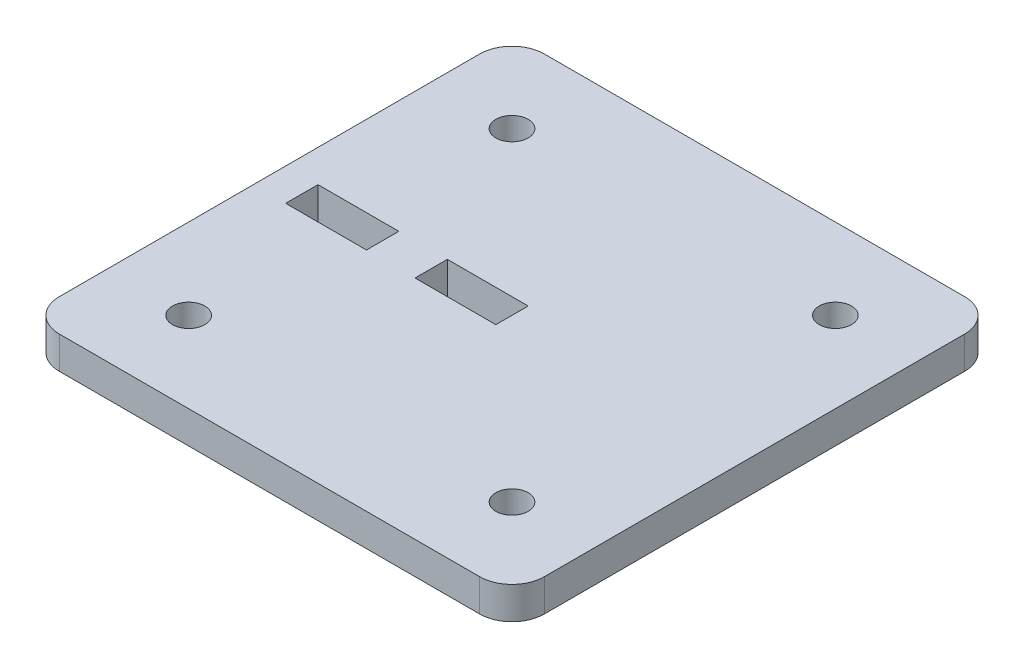
ISO-10303-21;
HEADER;
FILE_DESCRIPTION(('STEP AP214'),'2;1');
FILE_NAME('part.step','',(''),(''),'','','');
FILE_SCHEMA(('AUTOMOTIVE_DESIGN { 1 0 10303 214 1 1 1 1 }'));
ENDSEC;
DATA;
#1=APPLICATION_CONTEXT('core data for automotive mechanical design processes');
#2=APPLICATION_PROTOCOL_DEFINITION('international standard','automotive_design',2000,#1);
#3=PRODUCT_CONTEXT('',#1,'mechanical');
#4=PRODUCT('Part','Part','',(#3));
#5=PRODUCT_RELATED_PRODUCT_CATEGORY('part','',(#4));
#6=PRODUCT_DEFINITION_FORMATION('','',#4);
#7=PRODUCT_DEFINITION_CONTEXT('part definition',#1,'design');
#8=PRODUCT_DEFINITION('design','',#6,#7);
#9=PRODUCT_DEFINITION_SHAPE('','',#8);
#10=(LENGTH_UNIT() NAMED_UNIT(*) SI_UNIT(.MILLI.,.METRE.));
#11=(NAMED_UNIT(*) PLANE_ANGLE_UNIT() SI_UNIT($,.RADIAN.));
#12=(NAMED_UNIT(*) SI_UNIT($,.STERADIAN.) SOLID_ANGLE_UNIT());
#13=UNCERTAINTY_MEASURE_WITH_UNIT(LENGTH_MEASURE(1.E-05),#10,'distance_accuracy_value','');
#14=(GEOMETRIC_REPRESENTATION_CONTEXT(3) GLOBAL_UNCERTAINTY_ASSIGNED_CONTEXT((#13)) GLOBAL_UNIT_ASSIGNED_CONTEXT((#10,
#11,#12)) REPRESENTATION_CONTEXT('',''));
#15=CARTESIAN_POINT('',(0.,0.,0.));
#16=DIRECTION('',(0.,0.,1.));
#17=DIRECTION('',(1.,0.,0.));
#18=AXIS2_PLACEMENT_3D('',#15,#16,#17);
#19=CARTESIAN_POINT('',(-15.,2.,15.));
#20=DIRECTION('',(1.,0.,0.));
#21=DIRECTION('',(0.,0.,-1.));
#22=AXIS2_PLACEMENT_3D('',#19,#20,#21);
#23=PLANE('',#22);
#24=DIRECTION('',(0.,0.,1.));
#25=VECTOR('',#24,1.);
#26=CARTESIAN_POINT('',(-15.,2.,15.));
#27=LINE('',#26,#25);
#28=CARTESIAN_POINT('',(-15.,2.,-13.));
#29=VERTEX_POINT('',#28);
#30=CARTESIAN_POINT('',(-15.,2.,13.));
#31=VERTEX_POINT('',#30);
#32=EDGE_CURVE('E228',#29,#31,#27,.T.);
#33=ORIENTED_EDGE('',*,*,#32,.F.);
#34=DIRECTION('',(0.,-1.,0.));
#35=VECTOR('',#34,1.);
#36=CARTESIAN_POINT('',(-15.,2.,-13.));
#37=LINE('',#36,#35);
#38=CARTESIAN_POINT('',(-15.,0.,-13.));
#39=VERTEX_POINT('',#38);
#40=EDGE_CURVE('E250',#29,#39,#37,.T.);
#41=ORIENTED_EDGE('',*,*,#40,.T.);
#42=DIRECTION('',(0.,0.,1.));
#43=VECTOR('',#42,1.);
#44=CARTESIAN_POINT('',(-15.,0.,15.));
#45=LINE('',#44,#43);
#46=CARTESIAN_POINT('',(-15.,0.,13.));
#47=VERTEX_POINT('',#46);
#48=EDGE_CURVE('E221',#39,#47,#45,.T.);
#49=ORIENTED_EDGE('',*,*,#48,.T.);
#50=DIRECTION('',(0.,-1.,0.));
#51=VECTOR('',#50,1.);
#52=CARTESIAN_POINT('',(-15.,2.,13.));
#53=LINE('',#52,#51);
#54=EDGE_CURVE('E239',#47,#31,#53,.F.);
#55=ORIENTED_EDGE('',*,*,#54,.T.);
#56=EDGE_LOOP('',(#33,#41,#49,#55));
#57=FACE_BOUND('',#56,.T.);
#58=ADVANCED_FACE('F34',(#57),#23,.F.);
#59=CARTESIAN_POINT('',(15.,2.,15.));
#60=DIRECTION('',(0.,0.,-1.));
#61=DIRECTION('',(-1.,0.,0.));
#62=AXIS2_PLACEMENT_3D('',#59,#60,#61);
#63=PLANE('',#62);
#64=DIRECTION('',(1.,0.,0.));
#65=VECTOR('',#64,1.);
#66=CARTESIAN_POINT('',(15.,0.,15.));
#67=LINE('',#66,#65);
#68=CARTESIAN_POINT('',(-13.,0.,15.));
#69=VERTEX_POINT('',#68);
#70=CARTESIAN_POINT('',(13.,0.,15.));
#71=VERTEX_POINT('',#70);
#72=EDGE_CURVE('E242',#69,#71,#67,.T.);
#73=ORIENTED_EDGE('',*,*,#72,.T.);
#74=DIRECTION('',(0.,-1.,0.));
#75=VECTOR('',#74,1.);
#76=CARTESIAN_POINT('',(13.,2.,15.));
#77=LINE('',#76,#75);
#78=CARTESIAN_POINT('',(13.,2.,15.));
#79=VERTEX_POINT('',#78);
#80=EDGE_CURVE('E11',#71,#79,#77,.F.);
#81=ORIENTED_EDGE('',*,*,#80,.T.);
#82=DIRECTION('',(1.,0.,0.));
#83=VECTOR('',#82,1.);
#84=CARTESIAN_POINT('',(15.,2.,15.));
#85=LINE('',#84,#83);
#86=CARTESIAN_POINT('',(-13.,2.,15.));
#87=VERTEX_POINT('',#86);
#88=EDGE_CURVE('E231',#87,#79,#85,.T.);
#89=ORIENTED_EDGE('',*,*,#88,.F.);
#90=DIRECTION('',(0.,-1.,0.));
#91=VECTOR('',#90,1.);
#92=CARTESIAN_POINT('',(-13.,2.,15.));
#93=LINE('',#92,#91);
#94=EDGE_CURVE('E42',#87,#69,#93,.T.);
#95=ORIENTED_EDGE('',*,*,#94,.T.);
#96=EDGE_LOOP('',(#73,#81,#89,#95));
#97=FACE_BOUND('',#96,.T.);
#98=ADVANCED_FACE('F281',(#97),#63,.F.);
#99=CARTESIAN_POINT('',(15.,2.,15.));
#100=DIRECTION('',(-1.,0.,0.));
#101=DIRECTION('',(0.,0.,1.));
#102=AXIS2_PLACEMENT_3D('',#99,#100,#101);
#103=PLANE('',#102);
#104=DIRECTION('',(0.,0.,-1.));
#105=VECTOR('',#104,1.);
#106=CARTESIAN_POINT('',(15.,0.,15.));
#107=LINE('',#106,#105);
#108=CARTESIAN_POINT('',(15.,0.,13.));
#109=VERTEX_POINT('',#108);
#110=CARTESIAN_POINT('',(15.,0.,-13.));
#111=VERTEX_POINT('',#110);
#112=EDGE_CURVE('E245',#109,#111,#107,.T.);
#113=ORIENTED_EDGE('',*,*,#112,.T.);
#114=DIRECTION('',(0.,-1.,0.));
#115=VECTOR('',#114,1.);
#116=CARTESIAN_POINT('',(15.,2.,-13.));
#117=LINE('',#116,#115);
#118=CARTESIAN_POINT('',(15.,2.,-13.));
#119=VERTEX_POINT('',#118);
#120=EDGE_CURVE('E49',#111,#119,#117,.F.);
#121=ORIENTED_EDGE('',*,*,#120,.T.);
#122=DIRECTION('',(0.,0.,-1.));
#123=VECTOR('',#122,1.);
#124=CARTESIAN_POINT('',(15.,2.,15.));
#125=LINE('',#124,#123);
#126=CARTESIAN_POINT('',(15.,2.,13.));
#127=VERTEX_POINT('',#126);
#128=EDGE_CURVE('E234',#127,#119,#125,.T.);
#129=ORIENTED_EDGE('',*,*,#128,.F.);
#130=DIRECTION('',(0.,-1.,0.));
#131=VECTOR('',#130,1.);
#132=CARTESIAN_POINT('',(15.,2.,13.));
#133=LINE('',#132,#131);
#134=EDGE_CURVE('E273',#127,#109,#133,.T.);
#135=ORIENTED_EDGE('',*,*,#134,.T.);
#136=EDGE_LOOP('',(#113,#121,#129,#135));
#137=FACE_BOUND('',#136,.T.);
#138=ADVANCED_FACE('F291',(#137),#103,.F.);
#139=CARTESIAN_POINT('',(15.,2.,-15.));
#140=DIRECTION('',(0.,0.,1.));
#141=DIRECTION('',(1.,0.,0.));
#142=AXIS2_PLACEMENT_3D('',#139,#140,#141);
#143=PLANE('',#142);
#144=DIRECTION('',(-1.,0.,0.));
#145=VECTOR('',#144,1.);
#146=CARTESIAN_POINT('',(15.,0.,-15.));
#147=LINE('',#146,#145);
#148=CARTESIAN_POINT('',(13.,0.,-15.));
#149=VERTEX_POINT('',#148);
#150=CARTESIAN_POINT('',(-13.,0.,-15.));
#151=VERTEX_POINT('',#150);
#152=EDGE_CURVE('E232',#149,#151,#147,.T.);
#153=ORIENTED_EDGE('',*,*,#152,.T.);
#154=DIRECTION('',(0.,-1.,0.));
#155=VECTOR('',#154,1.);
#156=CARTESIAN_POINT('',(-13.,2.,-15.));
#157=LINE('',#156,#155);
#158=CARTESIAN_POINT('',(-13.,2.,-15.));
#159=VERTEX_POINT('',#158);
#160=EDGE_CURVE('E264',#151,#159,#157,.F.);
#161=ORIENTED_EDGE('',*,*,#160,.T.);
#162=DIRECTION('',(-1.,0.,0.));
#163=VECTOR('',#162,1.);
#164=CARTESIAN_POINT('',(15.,2.,-15.));
#165=LINE('',#164,#163);
#166=CARTESIAN_POINT('',(13.,2.,-15.));
#167=VERTEX_POINT('',#166);
#168=EDGE_CURVE('E236',#167,#159,#165,.T.);
#169=ORIENTED_EDGE('',*,*,#168,.F.);
#170=DIRECTION('',(0.,-1.,0.));
#171=VECTOR('',#170,1.);
#172=CARTESIAN_POINT('',(13.,2.,-15.));
#173=LINE('',#172,#171);
#174=EDGE_CURVE('E261',#167,#149,#173,.T.);
#175=ORIENTED_EDGE('',*,*,#174,.T.);
#176=EDGE_LOOP('',(#153,#161,#169,#175));
#177=FACE_BOUND('',#176,.T.);
#178=ADVANCED_FACE('F300',(#177),#143,.F.);
#179=CARTESIAN_POINT('',(0.,2.,0.));
#180=DIRECTION('',(0.,1.,0.));
#181=DIRECTION('',(0.,0.,1.));
#182=AXIS2_PLACEMENT_3D('',#179,#180,#181);
#183=PLANE('',#182);
#184=CARTESIAN_POINT('',(-10.,2.,-10.));
#185=DIRECTION('',(0.,1.,0.));
#186=DIRECTION('',(0.,0.,-1.));
#187=AXIS2_PLACEMENT_3D('',#184,#185,#186);
#188=CIRCLE('',#187,1.);
#189=CARTESIAN_POINT('',(-10.,2.,-11.));
#190=VERTEX_POINT('',#189);
#191=EDGE_CURVE('E508',#190,#190,#188,.T.);
#192=ORIENTED_EDGE('',*,*,#191,.F.);
#193=EDGE_LOOP('',(#192));
#194=FACE_BOUND('',#193,.T.);
#195=CARTESIAN_POINT('',(-10.,2.,10.));
#196=DIRECTION('',(0.,1.,0.));
#197=DIRECTION('',(0.,0.,1.));
#198=AXIS2_PLACEMENT_3D('',#195,#196,#197);
#199=CIRCLE('',#198,1.);
#200=CARTESIAN_POINT('',(-10.,2.,11.));
#201=VERTEX_POINT('',#200);
#202=EDGE_CURVE('E512',#201,#201,#199,.T.);
#203=ORIENTED_EDGE('',*,*,#202,.F.);
#204=EDGE_LOOP('',(#203));
#205=FACE_BOUND('',#204,.T.);
#206=CARTESIAN_POINT('',(10.,2.,10.));
#207=DIRECTION('',(0.,1.,0.));
#208=DIRECTION('',(0.,0.,-1.));
#209=AXIS2_PLACEMENT_3D('',#206,#207,#208);
#210=CIRCLE('',#209,1.);
#211=CARTESIAN_POINT('',(10.,2.,9.));
#212=VERTEX_POINT('',#211);
#213=EDGE_CURVE('E516',#212,#212,#210,.T.);
#214=ORIENTED_EDGE('',*,*,#213,.F.);
#215=EDGE_LOOP('',(#214));
#216=FACE_BOUND('',#215,.T.);
#217=CARTESIAN_POINT('',(10.,2.,-10.));
#218=DIRECTION('',(0.,1.,0.));
#219=DIRECTION('',(0.,0.,1.));
#220=AXIS2_PLACEMENT_3D('',#217,#218,#219);
#221=CIRCLE('',#220,1.);
#222=CARTESIAN_POINT('',(10.,2.,-9.));
#223=VERTEX_POINT('',#222);
#224=EDGE_CURVE('E179',#223,#223,#221,.T.);
#225=ORIENTED_EDGE('',*,*,#224,.F.);
#226=EDGE_LOOP('',(#225));
#227=FACE_BOUND('',#226,.T.);
#228=DIRECTION('',(0.,0.,-1.));
#229=VECTOR('',#228,1.);
#230=CARTESIAN_POINT('',(-8.,2.,-0.999999999999999));
#231=LINE('',#230,#229);
#232=CARTESIAN_POINT('',(-8.,2.,1.));
#233=VERTEX_POINT('',#232);
#234=CARTESIAN_POINT('',(-8.,2.,-0.999999999999999));
#235=VERTEX_POINT('',#234);
#236=EDGE_CURVE('E155',#233,#235,#231,.T.);
#237=ORIENTED_EDGE('',*,*,#236,.F.);
#238=DIRECTION('',(1.,0.,0.));
#239=VECTOR('',#238,1.);
#240=CARTESIAN_POINT('',(-8.,2.,1.));
#241=LINE('',#240,#239);
#242=CARTESIAN_POINT('',(-13.,2.,1.));
#243=VERTEX_POINT('',#242);
#244=EDGE_CURVE('E173',#243,#233,#241,.T.);
#245=ORIENTED_EDGE('',*,*,#244,.F.);
#246=DIRECTION('',(0.,0.,1.));
#247=VECTOR('',#246,1.);
#248=CARTESIAN_POINT('',(-13.,2.,-0.999999999999999));
#249=LINE('',#248,#247);
#250=CARTESIAN_POINT('',(-13.,2.,-0.999999999999999));
#251=VERTEX_POINT('',#250);
#252=EDGE_CURVE('E176',#251,#243,#249,.T.);
#253=ORIENTED_EDGE('',*,*,#252,.F.);
#254=DIRECTION('',(-1.,0.,0.));
#255=VECTOR('',#254,1.);
#256=CARTESIAN_POINT('',(-8.,2.,-0.999999999999999));
#257=LINE('',#256,#255);
#258=EDGE_CURVE('E185',#235,#251,#257,.T.);
#259=ORIENTED_EDGE('',*,*,#258,.F.);
#260=EDGE_LOOP('',(#237,#245,#253,#259));
#261=FACE_BOUND('',#260,.T.);
#262=DIRECTION('',(0.,0.,-1.));
#263=VECTOR('',#262,1.);
#264=CARTESIAN_POINT('',(0.,2.,1.));
#265=LINE('',#264,#263);
#266=CARTESIAN_POINT('',(0.,2.,1.));
#267=VERTEX_POINT('',#266);
#268=CARTESIAN_POINT('',(0.,2.,-0.999999999999999));
#269=VERTEX_POINT('',#268);
#270=EDGE_CURVE('E192',#267,#269,#265,.T.);
#271=ORIENTED_EDGE('',*,*,#270,.F.);
#272=DIRECTION('',(1.,0.,0.));
#273=VECTOR('',#272,1.);
#274=CARTESIAN_POINT('',(0.,2.,1.));
#275=LINE('',#274,#273);
#276=CARTESIAN_POINT('',(-5.,2.,1.));
#277=VERTEX_POINT('',#276);
#278=EDGE_CURVE('E200',#277,#267,#275,.T.);
#279=ORIENTED_EDGE('',*,*,#278,.F.);
#280=DIRECTION('',(0.,0.,1.));
#281=VECTOR('',#280,1.);
#282=CARTESIAN_POINT('',(-5.,2.,1.));
#283=LINE('',#282,#281);
#284=CARTESIAN_POINT('',(-5.,2.,-0.999999999999999));
#285=VERTEX_POINT('',#284);
#286=EDGE_CURVE('E214',#285,#277,#283,.T.);
#287=ORIENTED_EDGE('',*,*,#286,.F.);
#288=DIRECTION('',(-1.,0.,0.));
#289=VECTOR('',#288,1.);
#290=CARTESIAN_POINT('',(0.,2.,-0.999999999999999));
#291=LINE('',#290,#289);
#292=EDGE_CURVE('E211',#269,#285,#291,.T.);
#293=ORIENTED_EDGE('',*,*,#292,.F.);
#294=EDGE_LOOP('',(#271,#279,#287,#293));
#295=FACE_BOUND('',#294,.T.);
#296=ORIENTED_EDGE('',*,*,#168,.T.);
#297=CARTESIAN_POINT('',(-13.,2.,-13.));
#298=DIRECTION('',(0.,1.,0.));
#299=DIRECTION('',(0.,0.,1.));
#300=AXIS2_PLACEMENT_3D('',#297,#298,#299);
#301=CIRCLE('',#300,2.);
#302=EDGE_CURVE('E271',#159,#29,#301,.T.);
#303=ORIENTED_EDGE('',*,*,#302,.T.);
#304=ORIENTED_EDGE('',*,*,#32,.T.);
#305=CARTESIAN_POINT('',(-13.,2.,13.));
#306=DIRECTION('',(0.,1.,0.));
#307=DIRECTION('',(0.,0.,1.));
#308=AXIS2_PLACEMENT_3D('',#305,#306,#307);
#309=CIRCLE('',#308,2.);
#310=EDGE_CURVE('E266',#31,#87,#309,.T.);
#311=ORIENTED_EDGE('',*,*,#310,.T.);
#312=ORIENTED_EDGE('',*,*,#88,.T.);
#313=CARTESIAN_POINT('',(13.,2.,13.));
#314=DIRECTION('',(0.,1.,0.));
#315=DIRECTION('',(0.,0.,1.));
#316=AXIS2_PLACEMENT_3D('',#313,#314,#315);
#317=CIRCLE('',#316,2.);
#318=EDGE_CURVE('E56',#79,#127,#317,.T.);
#319=ORIENTED_EDGE('',*,*,#318,.T.);
#320=ORIENTED_EDGE('',*,*,#128,.T.);
#321=CARTESIAN_POINT('',(13.,2.,-13.));
#322=DIRECTION('',(0.,1.,0.));
#323=DIRECTION('',(0.,0.,1.));
#324=AXIS2_PLACEMENT_3D('',#321,#322,#323);
#325=CIRCLE('',#324,2.);
#326=EDGE_CURVE('E269',#119,#167,#325,.T.);
#327=ORIENTED_EDGE('',*,*,#326,.T.);
#328=EDGE_LOOP('',(#296,#303,#304,#311,#312,#319,#320,#327));
#329=FACE_BOUND('',#328,.T.);
#330=ADVANCED_FACE('F293',(#194,#205,#216,#227,#261,#295,#329),#183,.T.);
#331=CARTESIAN_POINT('',(0.,0.,0.));
#332=DIRECTION('',(0.,1.,0.));
#333=DIRECTION('',(0.,0.,1.));
#334=AXIS2_PLACEMENT_3D('',#331,#332,#333);
#335=PLANE('',#334);
#336=CARTESIAN_POINT('',(-10.,0.,-10.));
#337=DIRECTION('',(0.,1.,0.));
#338=DIRECTION('',(0.,0.,-1.));
#339=AXIS2_PLACEMENT_3D('',#336,#337,#338);
#340=CIRCLE('',#339,1.);
#341=CARTESIAN_POINT('',(-10.,0.,-11.));
#342=VERTEX_POINT('',#341);
#343=EDGE_CURVE('E542',#342,#342,#340,.T.);
#344=ORIENTED_EDGE('',*,*,#343,.T.);
#345=EDGE_LOOP('',(#344));
#346=FACE_BOUND('',#345,.T.);
#347=CARTESIAN_POINT('',(-10.,0.,10.));
#348=DIRECTION('',(0.,1.,0.));
#349=DIRECTION('',(0.,0.,1.));
#350=AXIS2_PLACEMENT_3D('',#347,#348,#349);
#351=CIRCLE('',#350,1.);
#352=CARTESIAN_POINT('',(-10.,0.,11.));
#353=VERTEX_POINT('',#352);
#354=EDGE_CURVE('E538',#353,#353,#351,.T.);
#355=ORIENTED_EDGE('',*,*,#354,.T.);
#356=EDGE_LOOP('',(#355));
#357=FACE_BOUND('',#356,.T.);
#358=CARTESIAN_POINT('',(10.,0.,10.));
#359=DIRECTION('',(0.,1.,0.));
#360=DIRECTION('',(0.,0.,-1.));
#361=AXIS2_PLACEMENT_3D('',#358,#359,#360);
#362=CIRCLE('',#361,1.);
#363=CARTESIAN_POINT('',(10.,0.,9.));
#364=VERTEX_POINT('',#363);
#365=EDGE_CURVE('E532',#364,#364,#362,.T.);
#366=ORIENTED_EDGE('',*,*,#365,.T.);
#367=EDGE_LOOP('',(#366));
#368=FACE_BOUND('',#367,.T.);
#369=CARTESIAN_POINT('',(10.,0.,-10.));
#370=DIRECTION('',(0.,1.,0.));
#371=DIRECTION('',(0.,0.,1.));
#372=AXIS2_PLACEMENT_3D('',#369,#370,#371);
#373=CIRCLE('',#372,1.);
#374=CARTESIAN_POINT('',(10.,0.,-9.));
#375=VERTEX_POINT('',#374);
#376=EDGE_CURVE('E186',#375,#375,#373,.T.);
#377=ORIENTED_EDGE('',*,*,#376,.T.);
#378=EDGE_LOOP('',(#377));
#379=FACE_BOUND('',#378,.T.);
#380=DIRECTION('',(1.,0.,0.));
#381=VECTOR('',#380,1.);
#382=CARTESIAN_POINT('',(-8.,0.,1.));
#383=LINE('',#382,#381);
#384=CARTESIAN_POINT('',(-13.,0.,1.));
#385=VERTEX_POINT('',#384);
#386=CARTESIAN_POINT('',(-8.,0.,1.));
#387=VERTEX_POINT('',#386);
#388=EDGE_CURVE('E160',#385,#387,#383,.T.);
#389=ORIENTED_EDGE('',*,*,#388,.T.);
#390=DIRECTION('',(0.,0.,-1.));
#391=VECTOR('',#390,1.);
#392=CARTESIAN_POINT('',(-8.,0.,-0.999999999999999));
#393=LINE('',#392,#391);
#394=CARTESIAN_POINT('',(-8.,0.,-0.999999999999999));
#395=VERTEX_POINT('',#394);
#396=EDGE_CURVE('E152',#387,#395,#393,.T.);
#397=ORIENTED_EDGE('',*,*,#396,.T.);
#398=DIRECTION('',(-1.,0.,0.));
#399=VECTOR('',#398,1.);
#400=CARTESIAN_POINT('',(-8.,0.,-0.999999999999999));
#401=LINE('',#400,#399);
#402=CARTESIAN_POINT('',(-13.,0.,-0.999999999999999));
#403=VERTEX_POINT('',#402);
#404=EDGE_CURVE('E164',#395,#403,#401,.T.);
#405=ORIENTED_EDGE('',*,*,#404,.T.);
#406=DIRECTION('',(0.,0.,1.));
#407=VECTOR('',#406,1.);
#408=CARTESIAN_POINT('',(-13.,0.,-0.999999999999999));
#409=LINE('',#408,#407);
#410=EDGE_CURVE('E168',#403,#385,#409,.T.);
#411=ORIENTED_EDGE('',*,*,#410,.T.);
#412=EDGE_LOOP('',(#389,#397,#405,#411));
#413=FACE_BOUND('',#412,.T.);
#414=DIRECTION('',(1.,0.,0.));
#415=VECTOR('',#414,1.);
#416=CARTESIAN_POINT('',(0.,0.,1.));
#417=LINE('',#416,#415);
#418=CARTESIAN_POINT('',(-5.,0.,1.));
#419=VERTEX_POINT('',#418);
#420=CARTESIAN_POINT('',(0.,0.,1.));
#421=VERTEX_POINT('',#420);
#422=EDGE_CURVE('E206',#419,#421,#417,.T.);
#423=ORIENTED_EDGE('',*,*,#422,.T.);
#424=DIRECTION('',(0.,0.,-1.));
#425=VECTOR('',#424,1.);
#426=CARTESIAN_POINT('',(0.,0.,1.));
#427=LINE('',#426,#425);
#428=CARTESIAN_POINT('',(0.,0.,-0.999999999999999));
#429=VERTEX_POINT('',#428);
#430=EDGE_CURVE('E196',#421,#429,#427,.T.);
#431=ORIENTED_EDGE('',*,*,#430,.T.);
#432=DIRECTION('',(-1.,0.,0.));
#433=VECTOR('',#432,1.);
#434=CARTESIAN_POINT('',(0.,0.,-0.999999999999999));
#435=LINE('',#434,#433);
#436=CARTESIAN_POINT('',(-5.,0.,-0.999999999999999));
#437=VERTEX_POINT('',#436);
#438=EDGE_CURVE('E199',#429,#437,#435,.T.);
#439=ORIENTED_EDGE('',*,*,#438,.T.);
#440=DIRECTION('',(0.,0.,1.));
#441=VECTOR('',#440,1.);
#442=CARTESIAN_POINT('',(-5.,0.,1.));
#443=LINE('',#442,#441);
#444=EDGE_CURVE('E203',#437,#419,#443,.T.);
#445=ORIENTED_EDGE('',*,*,#444,.T.);
#446=EDGE_LOOP('',(#423,#431,#439,#445));
#447=FACE_BOUND('',#446,.T.);
#448=ORIENTED_EDGE('',*,*,#48,.F.);
#449=CARTESIAN_POINT('',(-13.,0.,-13.));
#450=DIRECTION('',(0.,1.,0.));
#451=DIRECTION('',(0.,0.,1.));
#452=AXIS2_PLACEMENT_3D('',#449,#450,#451);
#453=CIRCLE('',#452,2.);
#454=EDGE_CURVE('E259',#39,#151,#453,.F.);
#455=ORIENTED_EDGE('',*,*,#454,.T.);
#456=ORIENTED_EDGE('',*,*,#152,.F.);
#457=CARTESIAN_POINT('',(13.,0.,-13.));
#458=DIRECTION('',(0.,1.,0.));
#459=DIRECTION('',(0.,0.,1.));
#460=AXIS2_PLACEMENT_3D('',#457,#458,#459);
#461=CIRCLE('',#460,2.);
#462=EDGE_CURVE('E257',#149,#111,#461,.F.);
#463=ORIENTED_EDGE('',*,*,#462,.T.);
#464=ORIENTED_EDGE('',*,*,#112,.F.);
#465=CARTESIAN_POINT('',(13.,0.,13.));
#466=DIRECTION('',(0.,1.,0.));
#467=DIRECTION('',(0.,0.,1.));
#468=AXIS2_PLACEMENT_3D('',#465,#466,#467);
#469=CIRCLE('',#468,2.);
#470=EDGE_CURVE('E255',#109,#71,#469,.F.);
#471=ORIENTED_EDGE('',*,*,#470,.T.);
#472=ORIENTED_EDGE('',*,*,#72,.F.);
#473=CARTESIAN_POINT('',(-13.,0.,13.));
#474=DIRECTION('',(0.,1.,0.));
#475=DIRECTION('',(0.,0.,1.));
#476=AXIS2_PLACEMENT_3D('',#473,#474,#475);
#477=CIRCLE('',#476,2.);
#478=EDGE_CURVE('E253',#69,#47,#477,.F.);
#479=ORIENTED_EDGE('',*,*,#478,.T.);
#480=EDGE_LOOP('',(#448,#455,#456,#463,#464,#471,#472,#479));
#481=FACE_BOUND('',#480,.T.);
#482=ADVANCED_FACE('F170',(#346,#357,#368,#379,#413,#447,#481),#335,.F.);
#483=CARTESIAN_POINT('',(0.,0.,1.));
#484=DIRECTION('',(1.,0.,0.));
#485=DIRECTION('',(0.,0.,-1.));
#486=AXIS2_PLACEMENT_3D('',#483,#484,#485);
#487=PLANE('',#486);
#488=ORIENTED_EDGE('',*,*,#270,.T.);
#489=DIRECTION('',(0.,1.,0.));
#490=VECTOR('',#489,1.);
#491=CARTESIAN_POINT('',(0.,0.,-0.999999999999999));
#492=LINE('',#491,#490);
#493=EDGE_CURVE('E209',#429,#269,#492,.T.);
#494=ORIENTED_EDGE('',*,*,#493,.F.);
#495=ORIENTED_EDGE('',*,*,#430,.F.);
#496=DIRECTION('',(0.,1.,0.));
#497=VECTOR('',#496,1.);
#498=CARTESIAN_POINT('',(0.,0.,1.));
#499=LINE('',#498,#497);
#500=EDGE_CURVE('E219',#421,#267,#499,.T.);
#501=ORIENTED_EDGE('',*,*,#500,.T.);
#502=EDGE_LOOP('',(#488,#494,#495,#501));
#503=FACE_BOUND('',#502,.T.);
#504=ADVANCED_FACE('F440',(#503),#487,.F.);
#505=CARTESIAN_POINT('',(0.,0.,1.));
#506=DIRECTION('',(0.,0.,1.));
#507=DIRECTION('',(1.,0.,0.));
#508=AXIS2_PLACEMENT_3D('',#505,#506,#507);
#509=PLANE('',#508);
#510=ORIENTED_EDGE('',*,*,#278,.T.);
#511=ORIENTED_EDGE('',*,*,#500,.F.);
#512=ORIENTED_EDGE('',*,*,#422,.F.);
#513=DIRECTION('',(0.,1.,0.));
#514=VECTOR('',#513,1.);
#515=CARTESIAN_POINT('',(-5.,0.,1.));
#516=LINE('',#515,#514);
#517=EDGE_CURVE('E222',#419,#277,#516,.T.);
#518=ORIENTED_EDGE('',*,*,#517,.T.);
#519=EDGE_LOOP('',(#510,#511,#512,#518));
#520=FACE_BOUND('',#519,.T.);
#521=ADVANCED_FACE('F431',(#520),#509,.F.);
#522=CARTESIAN_POINT('',(-5.,0.,1.));
#523=DIRECTION('',(-1.,0.,0.));
#524=DIRECTION('',(0.,0.,1.));
#525=AXIS2_PLACEMENT_3D('',#522,#523,#524);
#526=PLANE('',#525);
#527=ORIENTED_EDGE('',*,*,#286,.T.);
#528=ORIENTED_EDGE('',*,*,#517,.F.);
#529=ORIENTED_EDGE('',*,*,#444,.F.);
#530=DIRECTION('',(0.,1.,0.));
#531=VECTOR('',#530,1.);
#532=CARTESIAN_POINT('',(-5.,0.,-0.999999999999999));
#533=LINE('',#532,#531);
#534=EDGE_CURVE('E224',#437,#285,#533,.T.);
#535=ORIENTED_EDGE('',*,*,#534,.T.);
#536=EDGE_LOOP('',(#527,#528,#529,#535));
#537=FACE_BOUND('',#536,.T.);
#538=ADVANCED_FACE('F422',(#537),#526,.F.);
#539=CARTESIAN_POINT('',(0.,0.,-0.999999999999999));
#540=DIRECTION('',(0.,0.,-1.));
#541=DIRECTION('',(-1.,0.,0.));
#542=AXIS2_PLACEMENT_3D('',#539,#540,#541);
#543=PLANE('',#542);
#544=ORIENTED_EDGE('',*,*,#292,.T.);
#545=ORIENTED_EDGE('',*,*,#534,.F.);
#546=ORIENTED_EDGE('',*,*,#438,.F.);
#547=ORIENTED_EDGE('',*,*,#493,.T.);
#548=EDGE_LOOP('',(#544,#545,#546,#547));
#549=FACE_BOUND('',#548,.T.);
#550=ADVANCED_FACE('F414',(#549),#543,.F.);
#551=CARTESIAN_POINT('',(-8.,0.,-0.999999999999999));
#552=DIRECTION('',(1.,0.,0.));
#553=DIRECTION('',(0.,0.,-1.));
#554=AXIS2_PLACEMENT_3D('',#551,#552,#553);
#555=PLANE('',#554);
#556=ORIENTED_EDGE('',*,*,#236,.T.);
#557=DIRECTION('',(0.,1.,0.));
#558=VECTOR('',#557,1.);
#559=CARTESIAN_POINT('',(-8.,0.,-0.999999999999999));
#560=LINE('',#559,#558);
#561=EDGE_CURVE('E148',#395,#235,#560,.T.);
#562=ORIENTED_EDGE('',*,*,#561,.F.);
#563=ORIENTED_EDGE('',*,*,#396,.F.);
#564=DIRECTION('',(0.,1.,0.));
#565=VECTOR('',#564,1.);
#566=CARTESIAN_POINT('',(-8.,0.,1.));
#567=LINE('',#566,#565);
#568=EDGE_CURVE('E190',#387,#233,#567,.T.);
#569=ORIENTED_EDGE('',*,*,#568,.T.);
#570=EDGE_LOOP('',(#556,#562,#563,#569));
#571=FACE_BOUND('',#570,.T.);
#572=ADVANCED_FACE('F150',(#571),#555,.F.);
#573=CARTESIAN_POINT('',(-8.,0.,1.));
#574=DIRECTION('',(0.,0.,1.));
#575=DIRECTION('',(1.,0.,0.));
#576=AXIS2_PLACEMENT_3D('',#573,#574,#575);
#577=PLANE('',#576);
#578=ORIENTED_EDGE('',*,*,#244,.T.);
#579=ORIENTED_EDGE('',*,*,#568,.F.);
#580=ORIENTED_EDGE('',*,*,#388,.F.);
#581=DIRECTION('',(0.,1.,0.));
#582=VECTOR('',#581,1.);
#583=CARTESIAN_POINT('',(-13.,0.,1.));
#584=LINE('',#583,#582);
#585=EDGE_CURVE('E193',#385,#243,#584,.T.);
#586=ORIENTED_EDGE('',*,*,#585,.T.);
#587=EDGE_LOOP('',(#578,#579,#580,#586));
#588=FACE_BOUND('',#587,.T.);
#589=ADVANCED_FACE('F397',(#588),#577,.F.);
#590=CARTESIAN_POINT('',(-13.,0.,-0.999999999999999));
#591=DIRECTION('',(-1.,0.,0.));
#592=DIRECTION('',(0.,0.,1.));
#593=AXIS2_PLACEMENT_3D('',#590,#591,#592);
#594=PLANE('',#593);
#595=ORIENTED_EDGE('',*,*,#252,.T.);
#596=ORIENTED_EDGE('',*,*,#585,.F.);
#597=ORIENTED_EDGE('',*,*,#410,.F.);
#598=DIRECTION('',(0.,1.,0.));
#599=VECTOR('',#598,1.);
#600=CARTESIAN_POINT('',(-13.,0.,-0.999999999999999));
#601=LINE('',#600,#599);
#602=EDGE_CURVE('E159',#403,#251,#601,.T.);
#603=ORIENTED_EDGE('',*,*,#602,.T.);
#604=EDGE_LOOP('',(#595,#596,#597,#603));
#605=FACE_BOUND('',#604,.T.);
#606=ADVANCED_FACE('F389',(#605),#594,.F.);
#607=CARTESIAN_POINT('',(-8.,0.,-0.999999999999999));
#608=DIRECTION('',(0.,0.,-1.));
#609=DIRECTION('',(-1.,0.,0.));
#610=AXIS2_PLACEMENT_3D('',#607,#608,#609);
#611=PLANE('',#610);
#612=ORIENTED_EDGE('',*,*,#258,.T.);
#613=ORIENTED_EDGE('',*,*,#602,.F.);
#614=ORIENTED_EDGE('',*,*,#404,.F.);
#615=ORIENTED_EDGE('',*,*,#561,.T.);
#616=EDGE_LOOP('',(#612,#613,#614,#615));
#617=FACE_BOUND('',#616,.T.);
#618=ADVANCED_FACE('F165',(#617),#611,.F.);
#619=CARTESIAN_POINT('',(10.,0.,-10.));
#620=DIRECTION('',(0.,1.,0.));
#621=DIRECTION('',(0.,0.,1.));
#622=AXIS2_PLACEMENT_3D('',#619,#620,#621);
#623=CYLINDRICAL_SURFACE('',#622,1.);
#624=ORIENTED_EDGE('',*,*,#376,.F.);
#625=EDGE_LOOP('',(#624));
#626=FACE_BOUND('',#625,.T.);
#627=ORIENTED_EDGE('',*,*,#224,.T.);
#628=EDGE_LOOP('',(#627));
#629=FACE_BOUND('',#628,.T.);
#630=ADVANCED_FACE('F372',(#626,#629),#623,.F.);
#631=CARTESIAN_POINT('',(10.,0.,10.));
#632=DIRECTION('',(0.,1.,0.));
#633=DIRECTION('',(0.,0.,1.));
#634=AXIS2_PLACEMENT_3D('',#631,#632,#633);
#635=CYLINDRICAL_SURFACE('',#634,1.);
#636=ORIENTED_EDGE('',*,*,#365,.F.);
#637=EDGE_LOOP('',(#636));
#638=FACE_BOUND('',#637,.T.);
#639=ORIENTED_EDGE('',*,*,#213,.T.);
#640=EDGE_LOOP('',(#639));
#641=FACE_BOUND('',#640,.T.);
#642=ADVANCED_FACE('F363',(#638,#641),#635,.F.);
#643=CARTESIAN_POINT('',(-10.,0.,10.));
#644=DIRECTION('',(0.,1.,0.));
#645=DIRECTION('',(0.,0.,1.));
#646=AXIS2_PLACEMENT_3D('',#643,#644,#645);
#647=CYLINDRICAL_SURFACE('',#646,1.);
#648=ORIENTED_EDGE('',*,*,#354,.F.);
#649=EDGE_LOOP('',(#648));
#650=FACE_BOUND('',#649,.T.);
#651=ORIENTED_EDGE('',*,*,#202,.T.);
#652=EDGE_LOOP('',(#651));
#653=FACE_BOUND('',#652,.T.);
#654=ADVANCED_FACE('F354',(#650,#653),#647,.F.);
#655=CARTESIAN_POINT('',(-10.,0.,-10.));
#656=DIRECTION('',(0.,1.,0.));
#657=DIRECTION('',(0.,0.,1.));
#658=AXIS2_PLACEMENT_3D('',#655,#656,#657);
#659=CYLINDRICAL_SURFACE('',#658,1.);
#660=ORIENTED_EDGE('',*,*,#343,.F.);
#661=EDGE_LOOP('',(#660));
#662=FACE_BOUND('',#661,.T.);
#663=ORIENTED_EDGE('',*,*,#191,.T.);
#664=EDGE_LOOP('',(#663));
#665=FACE_BOUND('',#664,.T.);
#666=ADVANCED_FACE('F323',(#662,#665),#659,.F.);
#667=CARTESIAN_POINT('',(-13.,2.,-13.));
#668=DIRECTION('',(0.,-1.,0.));
#669=DIRECTION('',(0.,0.,-1.));
#670=AXIS2_PLACEMENT_3D('',#667,#668,#669);
#671=CYLINDRICAL_SURFACE('',#670,2.);
#672=ORIENTED_EDGE('',*,*,#302,.F.);
#673=ORIENTED_EDGE('',*,*,#160,.F.);
#674=ORIENTED_EDGE('',*,*,#454,.F.);
#675=ORIENTED_EDGE('',*,*,#40,.F.);
#676=EDGE_LOOP('',(#672,#673,#674,#675));
#677=FACE_BOUND('',#676,.T.);
#678=ADVANCED_FACE('F305',(#677),#671,.T.);
#679=CARTESIAN_POINT('',(13.,2.,-13.));
#680=DIRECTION('',(0.,-1.,0.));
#681=DIRECTION('',(0.,0.,-1.));
#682=AXIS2_PLACEMENT_3D('',#679,#680,#681);
#683=CYLINDRICAL_SURFACE('',#682,2.);
#684=ORIENTED_EDGE('',*,*,#326,.F.);
#685=ORIENTED_EDGE('',*,*,#120,.F.);
#686=ORIENTED_EDGE('',*,*,#462,.F.);
#687=ORIENTED_EDGE('',*,*,#174,.F.);
#688=EDGE_LOOP('',(#684,#685,#686,#687));
#689=FACE_BOUND('',#688,.T.);
#690=ADVANCED_FACE('F297',(#689),#683,.T.);
#691=CARTESIAN_POINT('',(13.,2.,13.));
#692=DIRECTION('',(0.,-1.,0.));
#693=DIRECTION('',(0.,0.,-1.));
#694=AXIS2_PLACEMENT_3D('',#691,#692,#693);
#695=CYLINDRICAL_SURFACE('',#694,2.);
#696=ORIENTED_EDGE('',*,*,#318,.F.);
#697=ORIENTED_EDGE('',*,*,#80,.F.);
#698=ORIENTED_EDGE('',*,*,#470,.F.);
#699=ORIENTED_EDGE('',*,*,#134,.F.);
#700=EDGE_LOOP('',(#696,#697,#698,#699));
#701=FACE_BOUND('',#700,.T.);
#702=ADVANCED_FACE('F290',(#701),#695,.T.);
#703=CARTESIAN_POINT('',(-13.,2.,13.));
#704=DIRECTION('',(0.,-1.,0.));
#705=DIRECTION('',(0.,0.,-1.));
#706=AXIS2_PLACEMENT_3D('',#703,#704,#705);
#707=CYLINDRICAL_SURFACE('',#706,2.);
#708=ORIENTED_EDGE('',*,*,#310,.F.);
#709=ORIENTED_EDGE('',*,*,#54,.F.);
#710=ORIENTED_EDGE('',*,*,#478,.F.);
#711=ORIENTED_EDGE('',*,*,#94,.F.);
#712=EDGE_LOOP('',(#708,#709,#710,#711));
#713=FACE_BOUND('',#712,.T.);
#714=ADVANCED_FACE('F36',(#713),#707,.T.);
#715=CLOSED_SHELL('',(#58,#98,#138,#178,#330,#482,#504,#521,#538,#550,#572,#589,#606,#618,#630,
#642,#654,#666,#678,#690,#702,#714));
#716=MANIFOLD_SOLID_BREP('B2',#715);
#717=ADVANCED_BREP_SHAPE_REPRESENTATION('',(#18,#716),#14);
#718=SHAPE_DEFINITION_REPRESENTATION(#9,#717);
ENDSEC;
END-ISO-10303-21;
